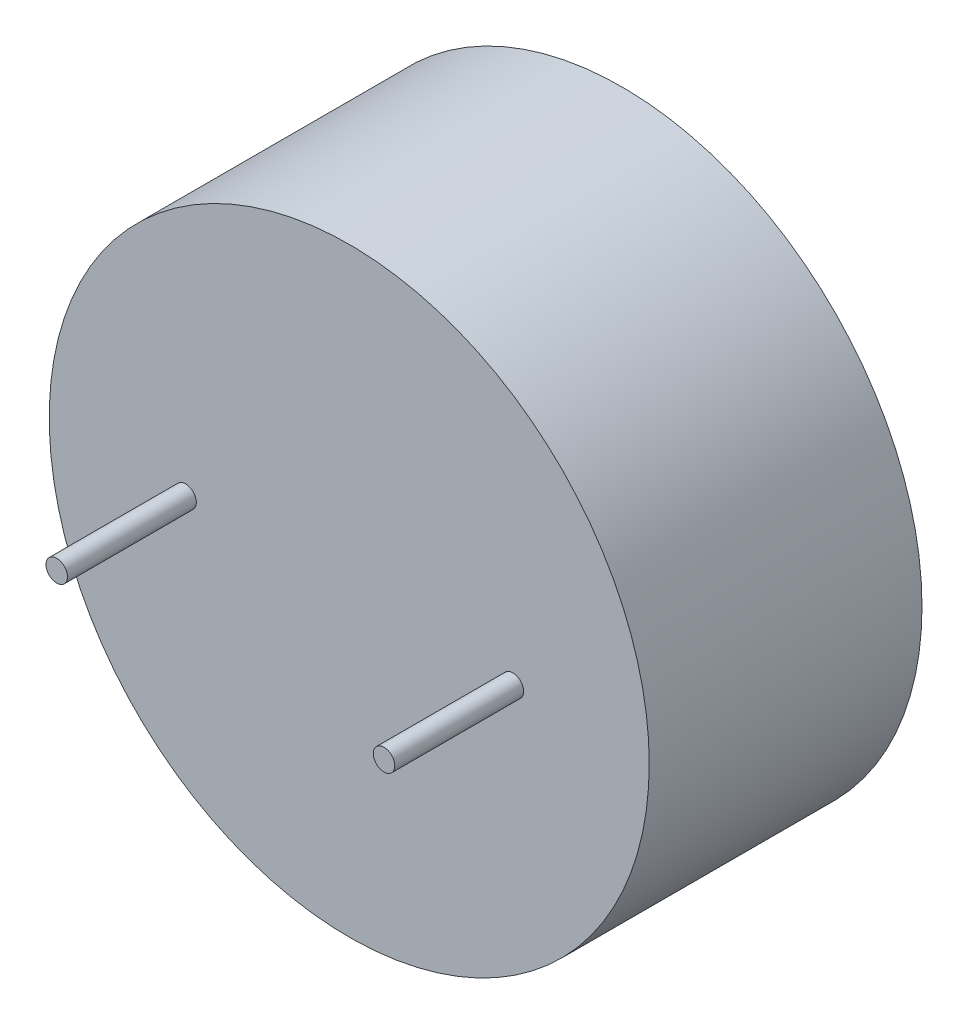
ISO-10303-21;
HEADER;
FILE_DESCRIPTION(('STEP AP214'),'2;1');
FILE_NAME('part.step','',(''),(''),'','','');
FILE_SCHEMA(('AUTOMOTIVE_DESIGN { 1 0 10303 214 1 1 1 1 }'));
ENDSEC;
DATA;
#1=APPLICATION_CONTEXT('core data for automotive mechanical design processes');
#2=APPLICATION_PROTOCOL_DEFINITION('international standard','automotive_design',2000,#1);
#3=PRODUCT_CONTEXT('',#1,'mechanical');
#4=PRODUCT('Part','Part','',(#3));
#5=PRODUCT_RELATED_PRODUCT_CATEGORY('part','',(#4));
#6=PRODUCT_DEFINITION_FORMATION('','',#4);
#7=PRODUCT_DEFINITION_CONTEXT('part definition',#1,'design');
#8=PRODUCT_DEFINITION('design','',#6,#7);
#9=PRODUCT_DEFINITION_SHAPE('','',#8);
#10=(LENGTH_UNIT() NAMED_UNIT(*) SI_UNIT(.MILLI.,.METRE.));
#11=(NAMED_UNIT(*) PLANE_ANGLE_UNIT() SI_UNIT($,.RADIAN.));
#12=(NAMED_UNIT(*) SI_UNIT($,.STERADIAN.) SOLID_ANGLE_UNIT());
#13=UNCERTAINTY_MEASURE_WITH_UNIT(LENGTH_MEASURE(1.E-05),#10,'distance_accuracy_value','');
#14=(GEOMETRIC_REPRESENTATION_CONTEXT(3) GLOBAL_UNCERTAINTY_ASSIGNED_CONTEXT((#13)) GLOBAL_UNIT_ASSIGNED_CONTEXT((#10,
#11,#12)) REPRESENTATION_CONTEXT('',''));
#15=CARTESIAN_POINT('',(0.,0.,0.));
#16=DIRECTION('',(0.,0.,1.));
#17=DIRECTION('',(1.,0.,0.));
#18=AXIS2_PLACEMENT_3D('',#15,#16,#17);
#19=CARTESIAN_POINT('',(0.,0.,12.7));
#20=DIRECTION('',(0.,0.,-1.));
#21=DIRECTION('',(-1.,0.,0.));
#22=AXIS2_PLACEMENT_3D('',#19,#20,#21);
#23=CYLINDRICAL_SURFACE('',#22,13.97);
#24=CARTESIAN_POINT('',(0.,0.,12.7));
#25=DIRECTION('',(0.,0.,1.));
#26=DIRECTION('',(1.,0.,0.));
#27=AXIS2_PLACEMENT_3D('',#24,#25,#26);
#28=CIRCLE('',#27,13.97);
#29=CARTESIAN_POINT('',(13.97,0.,12.7));
#30=VERTEX_POINT('',#29);
#31=EDGE_CURVE('E10',#30,#30,#28,.T.);
#32=ORIENTED_EDGE('',*,*,#31,.F.);
#33=EDGE_LOOP('',(#32));
#34=FACE_BOUND('',#33,.T.);
#35=CARTESIAN_POINT('',(0.,0.,0.));
#36=DIRECTION('',(0.,0.,1.));
#37=DIRECTION('',(1.,0.,0.));
#38=AXIS2_PLACEMENT_3D('',#35,#36,#37);
#39=CIRCLE('',#38,13.97);
#40=CARTESIAN_POINT('',(13.97,0.,0.));
#41=VERTEX_POINT('',#40);
#42=EDGE_CURVE('E44',#41,#41,#39,.T.);
#43=ORIENTED_EDGE('',*,*,#42,.T.);
#44=EDGE_LOOP('',(#43));
#45=FACE_BOUND('',#44,.T.);
#46=ADVANCED_FACE('F41',(#34,#45),#23,.T.);
#47=CARTESIAN_POINT('',(0.,0.,12.7));
#48=DIRECTION('',(0.,0.,1.));
#49=DIRECTION('',(1.,0.,0.));
#50=AXIS2_PLACEMENT_3D('',#47,#48,#49);
#51=PLANE('',#50);
#52=CARTESIAN_POINT('',(7.62,0.,12.7));
#53=DIRECTION('',(0.,0.,1.));
#54=DIRECTION('',(1.,0.,0.));
#55=AXIS2_PLACEMENT_3D('',#52,#53,#54);
#56=CIRCLE('',#55,0.500000000000002);
#57=CARTESIAN_POINT('',(8.12,0.,12.7));
#58=VERTEX_POINT('',#57);
#59=EDGE_CURVE('E59',#58,#58,#56,.T.);
#60=ORIENTED_EDGE('',*,*,#59,.F.);
#61=EDGE_LOOP('',(#60));
#62=FACE_BOUND('',#61,.T.);
#63=CARTESIAN_POINT('',(-7.62,0.,12.7));
#64=DIRECTION('',(0.,0.,1.));
#65=DIRECTION('',(1.,0.,0.));
#66=AXIS2_PLACEMENT_3D('',#63,#64,#65);
#67=CIRCLE('',#66,0.499998999999999);
#68=CARTESIAN_POINT('',(-7.120001,0.,12.7));
#69=VERTEX_POINT('',#68);
#70=EDGE_CURVE('E55',#69,#69,#67,.T.);
#71=ORIENTED_EDGE('',*,*,#70,.F.);
#72=EDGE_LOOP('',(#71));
#73=FACE_BOUND('',#72,.T.);
#74=ORIENTED_EDGE('',*,*,#31,.T.);
#75=EDGE_LOOP('',(#74));
#76=FACE_BOUND('',#75,.T.);
#77=ADVANCED_FACE('F73',(#62,#73,#76),#51,.T.);
#78=CARTESIAN_POINT('',(0.,0.,0.));
#79=DIRECTION('',(0.,0.,1.));
#80=DIRECTION('',(1.,0.,0.));
#81=AXIS2_PLACEMENT_3D('',#78,#79,#80);
#82=PLANE('',#81);
#83=ORIENTED_EDGE('',*,*,#42,.F.);
#84=EDGE_LOOP('',(#83));
#85=FACE_BOUND('',#84,.T.);
#86=ADVANCED_FACE('F76',(#85),#82,.F.);
#87=CARTESIAN_POINT('',(-7.62,0.,18.7));
#88=DIRECTION('',(0.,0.,-1.));
#89=DIRECTION('',(-1.,0.,0.));
#90=AXIS2_PLACEMENT_3D('',#87,#88,#89);
#91=CYLINDRICAL_SURFACE('',#90,0.499998999999999);
#92=CARTESIAN_POINT('',(-7.62,0.,18.7));
#93=DIRECTION('',(0.,0.,1.));
#94=DIRECTION('',(1.,0.,0.));
#95=AXIS2_PLACEMENT_3D('',#92,#93,#94);
#96=CIRCLE('',#95,0.499998999999999);
#97=CARTESIAN_POINT('',(-7.120001,0.,18.7));
#98=VERTEX_POINT('',#97);
#99=EDGE_CURVE('E53',#98,#98,#96,.T.);
#100=ORIENTED_EDGE('',*,*,#99,.F.);
#101=EDGE_LOOP('',(#100));
#102=FACE_BOUND('',#101,.T.);
#103=ORIENTED_EDGE('',*,*,#70,.T.);
#104=EDGE_LOOP('',(#103));
#105=FACE_BOUND('',#104,.T.);
#106=ADVANCED_FACE('F80',(#102,#105),#91,.T.);
#107=CARTESIAN_POINT('',(-7.62,0.,18.7));
#108=DIRECTION('',(0.,0.,1.));
#109=DIRECTION('',(1.,0.,0.));
#110=AXIS2_PLACEMENT_3D('',#107,#108,#109);
#111=PLANE('',#110);
#112=ORIENTED_EDGE('',*,*,#99,.T.);
#113=EDGE_LOOP('',(#112));
#114=FACE_BOUND('',#113,.T.);
#115=ADVANCED_FACE('F82',(#114),#111,.T.);
#116=CARTESIAN_POINT('',(7.62,0.,18.7));
#117=DIRECTION('',(0.,0.,-1.));
#118=DIRECTION('',(-1.,0.,0.));
#119=AXIS2_PLACEMENT_3D('',#116,#117,#118);
#120=CYLINDRICAL_SURFACE('',#119,0.500000000000002);
#121=CARTESIAN_POINT('',(7.62,0.,18.7));
#122=DIRECTION('',(0.,0.,1.));
#123=DIRECTION('',(1.,0.,0.));
#124=AXIS2_PLACEMENT_3D('',#121,#122,#123);
#125=CIRCLE('',#124,0.500000000000002);
#126=CARTESIAN_POINT('',(8.12,0.,18.7));
#127=VERTEX_POINT('',#126);
#128=EDGE_CURVE('E63',#127,#127,#125,.T.);
#129=ORIENTED_EDGE('',*,*,#128,.F.);
#130=EDGE_LOOP('',(#129));
#131=FACE_BOUND('',#130,.T.);
#132=ORIENTED_EDGE('',*,*,#59,.T.);
#133=EDGE_LOOP('',(#132));
#134=FACE_BOUND('',#133,.T.);
#135=ADVANCED_FACE('F71',(#131,#134),#120,.T.);
#136=CARTESIAN_POINT('',(7.62,0.,18.7));
#137=DIRECTION('',(0.,0.,1.));
#138=DIRECTION('',(1.,0.,0.));
#139=AXIS2_PLACEMENT_3D('',#136,#137,#138);
#140=PLANE('',#139);
#141=ORIENTED_EDGE('',*,*,#128,.T.);
#142=EDGE_LOOP('',(#141));
#143=FACE_BOUND('',#142,.T.);
#144=ADVANCED_FACE('F136',(#143),#140,.T.);
#145=CLOSED_SHELL('',(#46,#77,#86,#106,#115,#135,#144));
#146=MANIFOLD_SOLID_BREP('B2',#145);
#147=ADVANCED_BREP_SHAPE_REPRESENTATION('',(#18,#146),#14);
#148=SHAPE_DEFINITION_REPRESENTATION(#9,#147);
ENDSEC;
END-ISO-10303-21;
